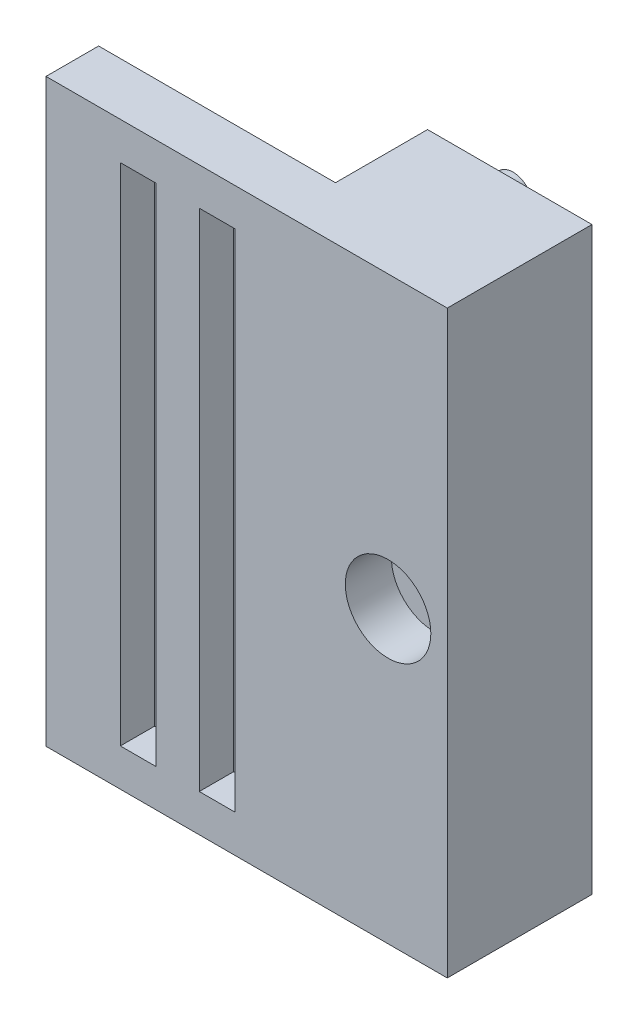
ISO-10303-21;
HEADER;
FILE_DESCRIPTION(('STEP AP214'),'2;1');
FILE_NAME('part.step','',(''),(''),'','','');
FILE_SCHEMA(('AUTOMOTIVE_DESIGN { 1 0 10303 214 1 1 1 1 }'));
ENDSEC;
DATA;
#1=APPLICATION_CONTEXT('core data for automotive mechanical design processes');
#2=APPLICATION_PROTOCOL_DEFINITION('international standard','automotive_design',2000,#1);
#3=PRODUCT_CONTEXT('',#1,'mechanical');
#4=PRODUCT('Part','Part','',(#3));
#5=PRODUCT_RELATED_PRODUCT_CATEGORY('part','',(#4));
#6=PRODUCT_DEFINITION_FORMATION('','',#4);
#7=PRODUCT_DEFINITION_CONTEXT('part definition',#1,'design');
#8=PRODUCT_DEFINITION('design','',#6,#7);
#9=PRODUCT_DEFINITION_SHAPE('','',#8);
#10=(LENGTH_UNIT() NAMED_UNIT(*) SI_UNIT(.MILLI.,.METRE.));
#11=(NAMED_UNIT(*) PLANE_ANGLE_UNIT() SI_UNIT($,.RADIAN.));
#12=(NAMED_UNIT(*) SI_UNIT($,.STERADIAN.) SOLID_ANGLE_UNIT());
#13=UNCERTAINTY_MEASURE_WITH_UNIT(LENGTH_MEASURE(1.E-05),#10,'distance_accuracy_value','');
#14=(GEOMETRIC_REPRESENTATION_CONTEXT(3) GLOBAL_UNCERTAINTY_ASSIGNED_CONTEXT((#13)) GLOBAL_UNIT_ASSIGNED_CONTEXT((#10,
#11,#12)) REPRESENTATION_CONTEXT('',''));
#15=CARTESIAN_POINT('',(0.,0.,0.));
#16=DIRECTION('',(0.,0.,1.));
#17=DIRECTION('',(1.,0.,0.));
#18=AXIS2_PLACEMENT_3D('',#15,#16,#17);
#19=CARTESIAN_POINT('',(-72.,0.,72.5));
#20=DIRECTION('',(0.,0.,1.));
#21=DIRECTION('',(1.,0.,0.));
#22=AXIS2_PLACEMENT_3D('',#19,#20,#21);
#23=PLANE('',#22);
#24=CARTESIAN_POINT('',(-72.,0.,72.5));
#25=DIRECTION('',(0.,0.,1.));
#26=DIRECTION('',(1.,0.,0.));
#27=AXIS2_PLACEMENT_3D('',#24,#25,#26);
#28=CIRCLE('',#27,1.7);
#29=CARTESIAN_POINT('',(-70.3,0.,72.5));
#30=VERTEX_POINT('',#29);
#31=EDGE_CURVE('E268',#30,#30,#28,.T.);
#32=ORIENTED_EDGE('',*,*,#31,.F.);
#33=EDGE_LOOP('',(#32));
#34=FACE_BOUND('',#33,.T.);
#35=CARTESIAN_POINT('',(-72.,0.,72.5));
#36=DIRECTION('',(0.,0.,1.));
#37=DIRECTION('',(1.,0.,0.));
#38=AXIS2_PLACEMENT_3D('',#35,#36,#37);
#39=CIRCLE('',#38,3.25);
#40=CARTESIAN_POINT('',(-68.75,0.,72.5));
#41=VERTEX_POINT('',#40);
#42=EDGE_CURVE('E11',#41,#41,#39,.T.);
#43=ORIENTED_EDGE('',*,*,#42,.T.);
#44=EDGE_LOOP('',(#43));
#45=FACE_BOUND('',#44,.T.);
#46=ADVANCED_FACE('F17',(#34,#45),#23,.T.);
#47=CARTESIAN_POINT('',(-76.5,18.,62.));
#48=DIRECTION('',(0.,0.,1.));
#49=DIRECTION('',(1.,0.,0.));
#50=AXIS2_PLACEMENT_3D('',#47,#48,#49);
#51=PLANE('',#50);
#52=CARTESIAN_POINT('',(-76.5,18.,62.));
#53=DIRECTION('',(0.,0.,1.));
#54=DIRECTION('',(1.,0.,0.));
#55=AXIS2_PLACEMENT_3D('',#52,#53,#54);
#56=CIRCLE('',#55,1.5);
#57=CARTESIAN_POINT('',(-75.,18.,62.));
#58=VERTEX_POINT('',#57);
#59=EDGE_CURVE('E264',#58,#58,#56,.T.);
#60=ORIENTED_EDGE('',*,*,#59,.F.);
#61=EDGE_LOOP('',(#60));
#62=FACE_BOUND('',#61,.T.);
#63=ADVANCED_FACE('F518',(#62),#51,.F.);
#64=CARTESIAN_POINT('',(-76.5,-18.,62.));
#65=DIRECTION('',(0.,0.,1.));
#66=DIRECTION('',(1.,0.,0.));
#67=AXIS2_PLACEMENT_3D('',#64,#65,#66);
#68=PLANE('',#67);
#69=CARTESIAN_POINT('',(-76.5,-18.,62.));
#70=DIRECTION('',(0.,0.,1.));
#71=DIRECTION('',(1.,0.,0.));
#72=AXIS2_PLACEMENT_3D('',#69,#70,#71);
#73=CIRCLE('',#72,1.5);
#74=CARTESIAN_POINT('',(-75.,-18.,62.));
#75=VERTEX_POINT('',#74);
#76=EDGE_CURVE('E260',#75,#75,#73,.T.);
#77=ORIENTED_EDGE('',*,*,#76,.F.);
#78=EDGE_LOOP('',(#77));
#79=FACE_BOUND('',#78,.T.);
#80=ADVANCED_FACE('F19',(#79),#68,.F.);
#81=CARTESIAN_POINT('',(-86.35,-19.2,73.4));
#82=DIRECTION('',(0.,0.,1.));
#83=DIRECTION('',(1.,0.,0.));
#84=AXIS2_PLACEMENT_3D('',#81,#82,#83);
#85=PLANE('',#84);
#86=DIRECTION('',(-1.,0.,0.));
#87=VECTOR('',#86,1.);
#88=CARTESIAN_POINT('',(-86.075,-18.75,73.4));
#89=LINE('',#88,#87);
#90=CARTESIAN_POINT('',(-84.2,-18.75,73.4));
#91=VERTEX_POINT('',#90);
#92=CARTESIAN_POINT('',(-85.8,-18.75,73.4));
#93=VERTEX_POINT('',#92);
#94=EDGE_CURVE('E235',#91,#93,#89,.T.);
#95=ORIENTED_EDGE('',*,*,#94,.T.);
#96=DIRECTION('',(0.,1.,0.));
#97=VECTOR('',#96,1.);
#98=CARTESIAN_POINT('',(-85.8,-18.975,73.4));
#99=LINE('',#98,#97);
#100=CARTESIAN_POINT('',(-85.8,18.75,73.4));
#101=VERTEX_POINT('',#100);
#102=EDGE_CURVE('E259',#93,#101,#99,.T.);
#103=ORIENTED_EDGE('',*,*,#102,.T.);
#104=DIRECTION('',(-1.,0.,0.));
#105=VECTOR('',#104,1.);
#106=CARTESIAN_POINT('',(-86.075,18.75,73.4));
#107=LINE('',#106,#105);
#108=CARTESIAN_POINT('',(-84.2,18.75,73.4));
#109=VERTEX_POINT('',#108);
#110=EDGE_CURVE('E151',#109,#101,#107,.T.);
#111=ORIENTED_EDGE('',*,*,#110,.F.);
#112=DIRECTION('',(0.,1.,0.));
#113=VECTOR('',#112,1.);
#114=CARTESIAN_POINT('',(-84.2,-18.975,73.4));
#115=LINE('',#114,#113);
#116=EDGE_CURVE('E249',#91,#109,#115,.T.);
#117=ORIENTED_EDGE('',*,*,#116,.F.);
#118=EDGE_LOOP('',(#95,#103,#111,#117));
#119=FACE_BOUND('',#118,.T.);
#120=DIRECTION('',(0.,1.,0.));
#121=VECTOR('',#120,1.);
#122=CARTESIAN_POINT('',(-86.35,-19.2,73.4));
#123=LINE('',#122,#121);
#124=CARTESIAN_POINT('',(-86.35,-19.2,73.4));
#125=VERTEX_POINT('',#124);
#126=CARTESIAN_POINT('',(-86.35,19.2,73.4));
#127=VERTEX_POINT('',#126);
#128=EDGE_CURVE('E27',#125,#127,#123,.T.);
#129=ORIENTED_EDGE('',*,*,#128,.F.);
#130=DIRECTION('',(1.,0.,0.));
#131=VECTOR('',#130,1.);
#132=CARTESIAN_POINT('',(-86.35,-19.2,73.4));
#133=LINE('',#132,#131);
#134=CARTESIAN_POINT('',(-83.65,-19.2,73.4));
#135=VERTEX_POINT('',#134);
#136=EDGE_CURVE('E118',#125,#135,#133,.T.);
#137=ORIENTED_EDGE('',*,*,#136,.T.);
#138=DIRECTION('',(0.,1.,0.));
#139=VECTOR('',#138,1.);
#140=CARTESIAN_POINT('',(-83.65,-19.2,73.4));
#141=LINE('',#140,#139);
#142=CARTESIAN_POINT('',(-83.65,19.2,73.4));
#143=VERTEX_POINT('',#142);
#144=EDGE_CURVE('E104',#135,#143,#141,.T.);
#145=ORIENTED_EDGE('',*,*,#144,.T.);
#146=DIRECTION('',(1.,0.,0.));
#147=VECTOR('',#146,1.);
#148=CARTESIAN_POINT('',(-86.35,19.2,73.4));
#149=LINE('',#148,#147);
#150=EDGE_CURVE('E21',#127,#143,#149,.T.);
#151=ORIENTED_EDGE('',*,*,#150,.F.);
#152=EDGE_LOOP('',(#129,#137,#145,#151));
#153=FACE_BOUND('',#152,.T.);
#154=ADVANCED_FACE('F119',(#119,#153),#85,.T.);
#155=CARTESIAN_POINT('',(-92.35,-19.2,73.4));
#156=DIRECTION('',(0.,0.,1.));
#157=DIRECTION('',(1.,0.,0.));
#158=AXIS2_PLACEMENT_3D('',#155,#156,#157);
#159=PLANE('',#158);
#160=DIRECTION('',(-1.,0.,0.));
#161=VECTOR('',#160,1.);
#162=CARTESIAN_POINT('',(-92.075,-18.75,73.4));
#163=LINE('',#162,#161);
#164=CARTESIAN_POINT('',(-90.2,-18.75,73.4));
#165=VERTEX_POINT('',#164);
#166=CARTESIAN_POINT('',(-91.8,-18.75,73.4));
#167=VERTEX_POINT('',#166);
#168=EDGE_CURVE('E161',#165,#167,#163,.T.);
#169=ORIENTED_EDGE('',*,*,#168,.T.);
#170=DIRECTION('',(0.,1.,0.));
#171=VECTOR('',#170,1.);
#172=CARTESIAN_POINT('',(-91.8,-18.975,73.4));
#173=LINE('',#172,#171);
#174=CARTESIAN_POINT('',(-91.8,18.75,73.4));
#175=VERTEX_POINT('',#174);
#176=EDGE_CURVE('E240',#167,#175,#173,.T.);
#177=ORIENTED_EDGE('',*,*,#176,.T.);
#178=DIRECTION('',(-1.,0.,0.));
#179=VECTOR('',#178,1.);
#180=CARTESIAN_POINT('',(-92.075,18.75,73.4));
#181=LINE('',#180,#179);
#182=CARTESIAN_POINT('',(-90.2,18.75,73.4));
#183=VERTEX_POINT('',#182);
#184=EDGE_CURVE('E226',#183,#175,#181,.T.);
#185=ORIENTED_EDGE('',*,*,#184,.F.);
#186=DIRECTION('',(0.,1.,0.));
#187=VECTOR('',#186,1.);
#188=CARTESIAN_POINT('',(-90.2,-18.975,73.4));
#189=LINE('',#188,#187);
#190=EDGE_CURVE('E218',#165,#183,#189,.T.);
#191=ORIENTED_EDGE('',*,*,#190,.F.);
#192=EDGE_LOOP('',(#169,#177,#185,#191));
#193=FACE_BOUND('',#192,.T.);
#194=DIRECTION('',(0.,1.,0.));
#195=VECTOR('',#194,1.);
#196=CARTESIAN_POINT('',(-92.35,-19.2,73.4));
#197=LINE('',#196,#195);
#198=CARTESIAN_POINT('',(-92.35,-19.2,73.4));
#199=VERTEX_POINT('',#198);
#200=CARTESIAN_POINT('',(-92.35,19.2,73.4));
#201=VERTEX_POINT('',#200);
#202=EDGE_CURVE('E130',#199,#201,#197,.T.);
#203=ORIENTED_EDGE('',*,*,#202,.F.);
#204=DIRECTION('',(1.,0.,0.));
#205=VECTOR('',#204,1.);
#206=CARTESIAN_POINT('',(-92.35,-19.2,73.4));
#207=LINE('',#206,#205);
#208=CARTESIAN_POINT('',(-89.65,-19.2,73.4));
#209=VERTEX_POINT('',#208);
#210=EDGE_CURVE('E273',#199,#209,#207,.T.);
#211=ORIENTED_EDGE('',*,*,#210,.T.);
#212=DIRECTION('',(0.,1.,0.));
#213=VECTOR('',#212,1.);
#214=CARTESIAN_POINT('',(-89.65,-19.2,73.4));
#215=LINE('',#214,#213);
#216=CARTESIAN_POINT('',(-89.65,19.2,73.4));
#217=VERTEX_POINT('',#216);
#218=EDGE_CURVE('E150',#209,#217,#215,.T.);
#219=ORIENTED_EDGE('',*,*,#218,.T.);
#220=DIRECTION('',(1.,0.,0.));
#221=VECTOR('',#220,1.);
#222=CARTESIAN_POINT('',(-92.35,19.2,73.4));
#223=LINE('',#222,#221);
#224=EDGE_CURVE('E136',#201,#217,#223,.T.);
#225=ORIENTED_EDGE('',*,*,#224,.F.);
#226=EDGE_LOOP('',(#203,#211,#219,#225));
#227=FACE_BOUND('',#226,.T.);
#228=ADVANCED_FACE('F513',(#193,#227),#159,.T.);
#229=CARTESIAN_POINT('',(-72.,0.,72.5));
#230=DIRECTION('',(0.,0.,1.));
#231=DIRECTION('',(1.,0.,0.));
#232=AXIS2_PLACEMENT_3D('',#229,#230,#231);
#233=CYLINDRICAL_SURFACE('',#232,3.25);
#234=CARTESIAN_POINT('',(-72.,0.,76.));
#235=DIRECTION('',(0.,0.,1.));
#236=DIRECTION('',(1.,0.,0.));
#237=AXIS2_PLACEMENT_3D('',#234,#235,#236);
#238=CIRCLE('',#237,3.25);
#239=CARTESIAN_POINT('',(-68.75,0.,76.));
#240=VERTEX_POINT('',#239);
#241=EDGE_CURVE('E194',#240,#240,#238,.T.);
#242=ORIENTED_EDGE('',*,*,#241,.T.);
#243=EDGE_LOOP('',(#242));
#244=FACE_BOUND('',#243,.T.);
#245=ORIENTED_EDGE('',*,*,#42,.F.);
#246=EDGE_LOOP('',(#245));
#247=FACE_BOUND('',#246,.T.);
#248=ADVANCED_FACE('F505',(#244,#247),#233,.F.);
#249=CARTESIAN_POINT('',(-86.35,-19.2,73.4));
#250=DIRECTION('',(1.,0.,0.));
#251=DIRECTION('',(0.,1.,0.));
#252=AXIS2_PLACEMENT_3D('',#249,#250,#251);
#253=PLANE('',#252);
#254=DIRECTION('',(0.,0.,1.));
#255=VECTOR('',#254,1.);
#256=CARTESIAN_POINT('',(-86.35,-19.2,73.4));
#257=LINE('',#256,#255);
#258=CARTESIAN_POINT('',(-86.35,-19.2,76.));
#259=VERTEX_POINT('',#258);
#260=EDGE_CURVE('E123',#125,#259,#257,.T.);
#261=ORIENTED_EDGE('',*,*,#260,.F.);
#262=ORIENTED_EDGE('',*,*,#128,.T.);
#263=DIRECTION('',(0.,0.,1.));
#264=VECTOR('',#263,1.);
#265=CARTESIAN_POINT('',(-86.35,19.2,73.4));
#266=LINE('',#265,#264);
#267=CARTESIAN_POINT('',(-86.35,19.2,76.));
#268=VERTEX_POINT('',#267);
#269=EDGE_CURVE('E115',#127,#268,#266,.T.);
#270=ORIENTED_EDGE('',*,*,#269,.T.);
#271=DIRECTION('',(0.,1.,0.));
#272=VECTOR('',#271,1.);
#273=CARTESIAN_POINT('',(-86.35,-20.625,76.));
#274=LINE('',#273,#272);
#275=EDGE_CURVE('E201',#259,#268,#274,.T.);
#276=ORIENTED_EDGE('',*,*,#275,.F.);
#277=EDGE_LOOP('',(#261,#262,#270,#276));
#278=FACE_BOUND('',#277,.T.);
#279=ADVANCED_FACE('F503',(#278),#253,.T.);
#280=CARTESIAN_POINT('',(-86.35,19.2,73.4));
#281=DIRECTION('',(0.,1.,0.));
#282=DIRECTION('',(1.,0.,0.));
#283=AXIS2_PLACEMENT_3D('',#280,#281,#282);
#284=PLANE('',#283);
#285=DIRECTION('',(-1.,0.,0.));
#286=VECTOR('',#285,1.);
#287=CARTESIAN_POINT('',(-83.175,19.2,76.));
#288=LINE('',#287,#286);
#289=CARTESIAN_POINT('',(-83.65,19.2,76.));
#290=VERTEX_POINT('',#289);
#291=EDGE_CURVE('E205',#290,#268,#288,.T.);
#292=ORIENTED_EDGE('',*,*,#291,.T.);
#293=ORIENTED_EDGE('',*,*,#269,.F.);
#294=ORIENTED_EDGE('',*,*,#150,.T.);
#295=DIRECTION('',(0.,0.,1.));
#296=VECTOR('',#295,1.);
#297=CARTESIAN_POINT('',(-83.65,19.2,73.4));
#298=LINE('',#297,#296);
#299=EDGE_CURVE('E112',#143,#290,#298,.T.);
#300=ORIENTED_EDGE('',*,*,#299,.T.);
#301=EDGE_LOOP('',(#292,#293,#294,#300));
#302=FACE_BOUND('',#301,.T.);
#303=ADVANCED_FACE('F498',(#302),#284,.F.);
#304=CARTESIAN_POINT('',(-83.65,-19.2,73.4));
#305=DIRECTION('',(1.,0.,0.));
#306=DIRECTION('',(0.,1.,0.));
#307=AXIS2_PLACEMENT_3D('',#304,#305,#306);
#308=PLANE('',#307);
#309=DIRECTION('',(0.,1.,0.));
#310=VECTOR('',#309,1.);
#311=CARTESIAN_POINT('',(-83.65,-20.625,76.));
#312=LINE('',#311,#310);
#313=CARTESIAN_POINT('',(-83.65,-19.2,76.));
#314=VERTEX_POINT('',#313);
#315=EDGE_CURVE('E209',#314,#290,#312,.T.);
#316=ORIENTED_EDGE('',*,*,#315,.T.);
#317=ORIENTED_EDGE('',*,*,#299,.F.);
#318=ORIENTED_EDGE('',*,*,#144,.F.);
#319=DIRECTION('',(0.,0.,1.));
#320=VECTOR('',#319,1.);
#321=CARTESIAN_POINT('',(-83.65,-19.2,73.4));
#322=LINE('',#321,#320);
#323=EDGE_CURVE('E110',#135,#314,#322,.T.);
#324=ORIENTED_EDGE('',*,*,#323,.T.);
#325=EDGE_LOOP('',(#316,#317,#318,#324));
#326=FACE_BOUND('',#325,.T.);
#327=ADVANCED_FACE('F107',(#326),#308,.F.);
#328=CARTESIAN_POINT('',(-86.35,-19.2,73.4));
#329=DIRECTION('',(0.,1.,0.));
#330=DIRECTION('',(1.,0.,0.));
#331=AXIS2_PLACEMENT_3D('',#328,#329,#330);
#332=PLANE('',#331);
#333=ORIENTED_EDGE('',*,*,#323,.F.);
#334=ORIENTED_EDGE('',*,*,#136,.F.);
#335=ORIENTED_EDGE('',*,*,#260,.T.);
#336=DIRECTION('',(-1.,0.,0.));
#337=VECTOR('',#336,1.);
#338=CARTESIAN_POINT('',(-83.175,-19.2,76.));
#339=LINE('',#338,#337);
#340=EDGE_CURVE('E128',#314,#259,#339,.T.);
#341=ORIENTED_EDGE('',*,*,#340,.F.);
#342=EDGE_LOOP('',(#333,#334,#335,#341));
#343=FACE_BOUND('',#342,.T.);
#344=ADVANCED_FACE('F126',(#343),#332,.T.);
#345=CARTESIAN_POINT('',(-92.35,-19.2,73.4));
#346=DIRECTION('',(1.,0.,0.));
#347=DIRECTION('',(0.,1.,0.));
#348=AXIS2_PLACEMENT_3D('',#345,#346,#347);
#349=PLANE('',#348);
#350=DIRECTION('',(0.,0.,1.));
#351=VECTOR('',#350,1.);
#352=CARTESIAN_POINT('',(-92.35,-19.2,73.4));
#353=LINE('',#352,#351);
#354=CARTESIAN_POINT('',(-92.35,-19.2,76.));
#355=VERTEX_POINT('',#354);
#356=EDGE_CURVE('E276',#199,#355,#353,.T.);
#357=ORIENTED_EDGE('',*,*,#356,.F.);
#358=ORIENTED_EDGE('',*,*,#202,.T.);
#359=DIRECTION('',(0.,0.,1.));
#360=VECTOR('',#359,1.);
#361=CARTESIAN_POINT('',(-92.35,19.2,73.4));
#362=LINE('',#361,#360);
#363=CARTESIAN_POINT('',(-92.35,19.2,76.));
#364=VERTEX_POINT('',#363);
#365=EDGE_CURVE('E146',#201,#364,#362,.T.);
#366=ORIENTED_EDGE('',*,*,#365,.T.);
#367=DIRECTION('',(0.,1.,0.));
#368=VECTOR('',#367,1.);
#369=CARTESIAN_POINT('',(-92.35,-20.625,76.));
#370=LINE('',#369,#368);
#371=EDGE_CURVE('E186',#355,#364,#370,.T.);
#372=ORIENTED_EDGE('',*,*,#371,.F.);
#373=EDGE_LOOP('',(#357,#358,#366,#372));
#374=FACE_BOUND('',#373,.T.);
#375=ADVANCED_FACE('F577',(#374),#349,.T.);
#376=CARTESIAN_POINT('',(-92.35,19.2,73.4));
#377=DIRECTION('',(0.,1.,0.));
#378=DIRECTION('',(1.,0.,0.));
#379=AXIS2_PLACEMENT_3D('',#376,#377,#378);
#380=PLANE('',#379);
#381=DIRECTION('',(-1.,0.,0.));
#382=VECTOR('',#381,1.);
#383=CARTESIAN_POINT('',(-86.175,19.2,76.));
#384=LINE('',#383,#382);
#385=CARTESIAN_POINT('',(-89.65,19.2,76.));
#386=VERTEX_POINT('',#385);
#387=EDGE_CURVE('E190',#386,#364,#384,.T.);
#388=ORIENTED_EDGE('',*,*,#387,.T.);
#389=ORIENTED_EDGE('',*,*,#365,.F.);
#390=ORIENTED_EDGE('',*,*,#224,.T.);
#391=DIRECTION('',(0.,0.,1.));
#392=VECTOR('',#391,1.);
#393=CARTESIAN_POINT('',(-89.65,19.2,73.4));
#394=LINE('',#393,#392);
#395=EDGE_CURVE('E281',#217,#386,#394,.T.);
#396=ORIENTED_EDGE('',*,*,#395,.T.);
#397=EDGE_LOOP('',(#388,#389,#390,#396));
#398=FACE_BOUND('',#397,.T.);
#399=ADVANCED_FACE('F540',(#398),#380,.F.);
#400=CARTESIAN_POINT('',(-89.65,-19.2,73.4));
#401=DIRECTION('',(1.,0.,0.));
#402=DIRECTION('',(0.,1.,0.));
#403=AXIS2_PLACEMENT_3D('',#400,#401,#402);
#404=PLANE('',#403);
#405=DIRECTION('',(0.,1.,0.));
#406=VECTOR('',#405,1.);
#407=CARTESIAN_POINT('',(-89.65,-20.625,76.));
#408=LINE('',#407,#406);
#409=CARTESIAN_POINT('',(-89.65,-19.2,76.));
#410=VERTEX_POINT('',#409);
#411=EDGE_CURVE('E195',#410,#386,#408,.T.);
#412=ORIENTED_EDGE('',*,*,#411,.T.);
#413=ORIENTED_EDGE('',*,*,#395,.F.);
#414=ORIENTED_EDGE('',*,*,#218,.F.);
#415=DIRECTION('',(0.,0.,1.));
#416=VECTOR('',#415,1.);
#417=CARTESIAN_POINT('',(-89.65,-19.2,73.4));
#418=LINE('',#417,#416);
#419=EDGE_CURVE('E272',#209,#410,#418,.T.);
#420=ORIENTED_EDGE('',*,*,#419,.T.);
#421=EDGE_LOOP('',(#412,#413,#414,#420));
#422=FACE_BOUND('',#421,.T.);
#423=ADVANCED_FACE('F536',(#422),#404,.F.);
#424=CARTESIAN_POINT('',(-92.35,-19.2,73.4));
#425=DIRECTION('',(0.,1.,0.));
#426=DIRECTION('',(1.,0.,0.));
#427=AXIS2_PLACEMENT_3D('',#424,#425,#426);
#428=PLANE('',#427);
#429=ORIENTED_EDGE('',*,*,#419,.F.);
#430=ORIENTED_EDGE('',*,*,#210,.F.);
#431=ORIENTED_EDGE('',*,*,#356,.T.);
#432=DIRECTION('',(-1.,0.,0.));
#433=VECTOR('',#432,1.);
#434=CARTESIAN_POINT('',(-86.175,-19.2,76.));
#435=LINE('',#434,#433);
#436=EDGE_CURVE('E184',#410,#355,#435,.T.);
#437=ORIENTED_EDGE('',*,*,#436,.F.);
#438=EDGE_LOOP('',(#429,#430,#431,#437));
#439=FACE_BOUND('',#438,.T.);
#440=ADVANCED_FACE('F539',(#439),#428,.T.);
#441=CARTESIAN_POINT('',(-72.,0.,48.5));
#442=DIRECTION('',(0.,0.,1.));
#443=DIRECTION('',(1.,0.,0.));
#444=AXIS2_PLACEMENT_3D('',#441,#442,#443);
#445=CYLINDRICAL_SURFACE('',#444,1.7);
#446=ORIENTED_EDGE('',*,*,#31,.T.);
#447=EDGE_LOOP('',(#446));
#448=FACE_BOUND('',#447,.T.);
#449=CARTESIAN_POINT('',(-72.,0.,65.));
#450=DIRECTION('',(0.,0.,1.));
#451=DIRECTION('',(1.,0.,0.));
#452=AXIS2_PLACEMENT_3D('',#449,#450,#451);
#453=CIRCLE('',#452,1.7);
#454=CARTESIAN_POINT('',(-70.3,0.,65.));
#455=VERTEX_POINT('',#454);
#456=EDGE_CURVE('E170',#455,#455,#453,.T.);
#457=ORIENTED_EDGE('',*,*,#456,.F.);
#458=EDGE_LOOP('',(#457));
#459=FACE_BOUND('',#458,.T.);
#460=ADVANCED_FACE('F567',(#448,#459),#445,.F.);
#461=CARTESIAN_POINT('',(-76.5,18.,62.));
#462=DIRECTION('',(0.,0.,1.));
#463=DIRECTION('',(1.,0.,0.));
#464=AXIS2_PLACEMENT_3D('',#461,#462,#463);
#465=CYLINDRICAL_SURFACE('',#464,1.5);
#466=CARTESIAN_POINT('',(-76.5,18.,65.));
#467=DIRECTION('',(0.,0.,1.));
#468=DIRECTION('',(1.,0.,0.));
#469=AXIS2_PLACEMENT_3D('',#466,#467,#468);
#470=CIRCLE('',#469,1.5);
#471=CARTESIAN_POINT('',(-75.,18.,65.));
#472=VERTEX_POINT('',#471);
#473=EDGE_CURVE('E166',#472,#472,#470,.T.);
#474=ORIENTED_EDGE('',*,*,#473,.F.);
#475=EDGE_LOOP('',(#474));
#476=FACE_BOUND('',#475,.T.);
#477=ORIENTED_EDGE('',*,*,#59,.T.);
#478=EDGE_LOOP('',(#477));
#479=FACE_BOUND('',#478,.T.);
#480=ADVANCED_FACE('F563',(#476,#479),#465,.T.);
#481=CARTESIAN_POINT('',(-76.5,-18.,62.));
#482=DIRECTION('',(0.,0.,1.));
#483=DIRECTION('',(1.,0.,0.));
#484=AXIS2_PLACEMENT_3D('',#481,#482,#483);
#485=CYLINDRICAL_SURFACE('',#484,1.5);
#486=CARTESIAN_POINT('',(-76.5,-18.,65.));
#487=DIRECTION('',(0.,0.,1.));
#488=DIRECTION('',(1.,0.,0.));
#489=AXIS2_PLACEMENT_3D('',#486,#487,#488);
#490=CIRCLE('',#489,1.5);
#491=CARTESIAN_POINT('',(-75.,-18.,65.));
#492=VERTEX_POINT('',#491);
#493=EDGE_CURVE('E145',#492,#492,#490,.T.);
#494=ORIENTED_EDGE('',*,*,#493,.F.);
#495=EDGE_LOOP('',(#494));
#496=FACE_BOUND('',#495,.T.);
#497=ORIENTED_EDGE('',*,*,#76,.T.);
#498=EDGE_LOOP('',(#497));
#499=FACE_BOUND('',#498,.T.);
#500=ADVANCED_FACE('F560',(#496,#499),#485,.T.);
#501=CARTESIAN_POINT('',(-85.8,-18.75,59.5));
#502=DIRECTION('',(1.,0.,0.));
#503=DIRECTION('',(0.,1.,0.));
#504=AXIS2_PLACEMENT_3D('',#501,#502,#503);
#505=PLANE('',#504);
#506=DIRECTION('',(0.,0.,1.));
#507=VECTOR('',#506,1.);
#508=CARTESIAN_POINT('',(-85.8,-18.75,59.5));
#509=LINE('',#508,#507);
#510=CARTESIAN_POINT('',(-85.8,-18.75,72.));
#511=VERTEX_POINT('',#510);
#512=EDGE_CURVE('E231',#511,#93,#509,.T.);
#513=ORIENTED_EDGE('',*,*,#512,.F.);
#514=DIRECTION('',(0.,1.,0.));
#515=VECTOR('',#514,1.);
#516=CARTESIAN_POINT('',(-85.8,-20.4,72.));
#517=LINE('',#516,#515);
#518=CARTESIAN_POINT('',(-85.8,18.75,72.));
#519=VERTEX_POINT('',#518);
#520=EDGE_CURVE('E316',#511,#519,#517,.T.);
#521=ORIENTED_EDGE('',*,*,#520,.T.);
#522=DIRECTION('',(0.,0.,1.));
#523=VECTOR('',#522,1.);
#524=CARTESIAN_POINT('',(-85.8,18.75,59.5));
#525=LINE('',#524,#523);
#526=EDGE_CURVE('E155',#519,#101,#525,.T.);
#527=ORIENTED_EDGE('',*,*,#526,.T.);
#528=ORIENTED_EDGE('',*,*,#102,.F.);
#529=EDGE_LOOP('',(#513,#521,#527,#528));
#530=FACE_BOUND('',#529,.T.);
#531=ADVANCED_FACE('F558',(#530),#505,.T.);
#532=CARTESIAN_POINT('',(-85.8,18.75,59.5));
#533=DIRECTION('',(0.,1.,0.));
#534=DIRECTION('',(1.,0.,0.));
#535=AXIS2_PLACEMENT_3D('',#532,#533,#534);
#536=PLANE('',#535);
#537=ORIENTED_EDGE('',*,*,#110,.T.);
#538=ORIENTED_EDGE('',*,*,#526,.F.);
#539=DIRECTION('',(-1.,0.,0.));
#540=VECTOR('',#539,1.);
#541=CARTESIAN_POINT('',(-91.9,18.75,72.));
#542=LINE('',#541,#540);
#543=CARTESIAN_POINT('',(-84.2,18.75,72.));
#544=VERTEX_POINT('',#543);
#545=EDGE_CURVE('E321',#544,#519,#542,.T.);
#546=ORIENTED_EDGE('',*,*,#545,.F.);
#547=DIRECTION('',(0.,0.,1.));
#548=VECTOR('',#547,1.);
#549=CARTESIAN_POINT('',(-84.2,18.75,59.5));
#550=LINE('',#549,#548);
#551=EDGE_CURVE('E156',#544,#109,#550,.T.);
#552=ORIENTED_EDGE('',*,*,#551,.T.);
#553=EDGE_LOOP('',(#537,#538,#546,#552));
#554=FACE_BOUND('',#553,.T.);
#555=ADVANCED_FACE('F554',(#554),#536,.F.);
#556=CARTESIAN_POINT('',(-84.2,-18.75,59.5));
#557=DIRECTION('',(1.,0.,0.));
#558=DIRECTION('',(0.,1.,0.));
#559=AXIS2_PLACEMENT_3D('',#556,#557,#558);
#560=PLANE('',#559);
#561=ORIENTED_EDGE('',*,*,#116,.T.);
#562=ORIENTED_EDGE('',*,*,#551,.F.);
#563=DIRECTION('',(0.,1.,0.));
#564=VECTOR('',#563,1.);
#565=CARTESIAN_POINT('',(-84.2,-20.4,72.));
#566=LINE('',#565,#564);
#567=CARTESIAN_POINT('',(-84.2,-18.75,72.));
#568=VERTEX_POINT('',#567);
#569=EDGE_CURVE('E336',#568,#544,#566,.T.);
#570=ORIENTED_EDGE('',*,*,#569,.F.);
#571=DIRECTION('',(0.,0.,1.));
#572=VECTOR('',#571,1.);
#573=CARTESIAN_POINT('',(-84.2,-18.75,59.5));
#574=LINE('',#573,#572);
#575=EDGE_CURVE('E236',#568,#91,#574,.T.);
#576=ORIENTED_EDGE('',*,*,#575,.T.);
#577=EDGE_LOOP('',(#561,#562,#570,#576));
#578=FACE_BOUND('',#577,.T.);
#579=ADVANCED_FACE('F551',(#578),#560,.F.);
#580=CARTESIAN_POINT('',(-85.8,-18.75,59.5));
#581=DIRECTION('',(0.,1.,0.));
#582=DIRECTION('',(1.,0.,0.));
#583=AXIS2_PLACEMENT_3D('',#580,#581,#582);
#584=PLANE('',#583);
#585=ORIENTED_EDGE('',*,*,#575,.F.);
#586=DIRECTION('',(-1.,0.,0.));
#587=VECTOR('',#586,1.);
#588=CARTESIAN_POINT('',(-91.9,-18.75,72.));
#589=LINE('',#588,#587);
#590=EDGE_CURVE('E320',#568,#511,#589,.T.);
#591=ORIENTED_EDGE('',*,*,#590,.T.);
#592=ORIENTED_EDGE('',*,*,#512,.T.);
#593=ORIENTED_EDGE('',*,*,#94,.F.);
#594=EDGE_LOOP('',(#585,#591,#592,#593));
#595=FACE_BOUND('',#594,.T.);
#596=ADVANCED_FACE('F535',(#595),#584,.T.);
#597=CARTESIAN_POINT('',(-91.8,-18.75,59.5));
#598=DIRECTION('',(1.,0.,0.));
#599=DIRECTION('',(0.,1.,0.));
#600=AXIS2_PLACEMENT_3D('',#597,#598,#599);
#601=PLANE('',#600);
#602=DIRECTION('',(0.,0.,1.));
#603=VECTOR('',#602,1.);
#604=CARTESIAN_POINT('',(-91.8,-18.75,59.5));
#605=LINE('',#604,#603);
#606=CARTESIAN_POINT('',(-91.8,-18.75,72.));
#607=VERTEX_POINT('',#606);
#608=EDGE_CURVE('E157',#607,#167,#605,.T.);
#609=ORIENTED_EDGE('',*,*,#608,.F.);
#610=DIRECTION('',(0.,1.,0.));
#611=VECTOR('',#610,1.);
#612=CARTESIAN_POINT('',(-91.8,-20.4,72.));
#613=LINE('',#612,#611);
#614=CARTESIAN_POINT('',(-91.8,18.75,72.));
#615=VERTEX_POINT('',#614);
#616=EDGE_CURVE('E332',#607,#615,#613,.T.);
#617=ORIENTED_EDGE('',*,*,#616,.T.);
#618=DIRECTION('',(0.,0.,1.));
#619=VECTOR('',#618,1.);
#620=CARTESIAN_POINT('',(-91.8,18.75,59.5));
#621=LINE('',#620,#619);
#622=EDGE_CURVE('E230',#615,#175,#621,.T.);
#623=ORIENTED_EDGE('',*,*,#622,.T.);
#624=ORIENTED_EDGE('',*,*,#176,.F.);
#625=EDGE_LOOP('',(#609,#617,#623,#624));
#626=FACE_BOUND('',#625,.T.);
#627=ADVANCED_FACE('F437',(#626),#601,.T.);
#628=CARTESIAN_POINT('',(-91.8,18.75,59.5));
#629=DIRECTION('',(0.,1.,0.));
#630=DIRECTION('',(1.,0.,0.));
#631=AXIS2_PLACEMENT_3D('',#628,#629,#630);
#632=PLANE('',#631);
#633=ORIENTED_EDGE('',*,*,#184,.T.);
#634=ORIENTED_EDGE('',*,*,#622,.F.);
#635=DIRECTION('',(-1.,0.,0.));
#636=VECTOR('',#635,1.);
#637=CARTESIAN_POINT('',(-94.9,18.75,72.));
#638=LINE('',#637,#636);
#639=CARTESIAN_POINT('',(-90.2,18.75,72.));
#640=VERTEX_POINT('',#639);
#641=EDGE_CURVE('E326',#640,#615,#638,.T.);
#642=ORIENTED_EDGE('',*,*,#641,.F.);
#643=DIRECTION('',(0.,0.,1.));
#644=VECTOR('',#643,1.);
#645=CARTESIAN_POINT('',(-90.2,18.75,59.5));
#646=LINE('',#645,#644);
#647=EDGE_CURVE('E222',#640,#183,#646,.T.);
#648=ORIENTED_EDGE('',*,*,#647,.T.);
#649=EDGE_LOOP('',(#633,#634,#642,#648));
#650=FACE_BOUND('',#649,.T.);
#651=ADVANCED_FACE('F450',(#650),#632,.F.);
#652=CARTESIAN_POINT('',(-90.2,-18.75,59.5));
#653=DIRECTION('',(1.,0.,0.));
#654=DIRECTION('',(0.,1.,0.));
#655=AXIS2_PLACEMENT_3D('',#652,#653,#654);
#656=PLANE('',#655);
#657=ORIENTED_EDGE('',*,*,#190,.T.);
#658=ORIENTED_EDGE('',*,*,#647,.F.);
#659=DIRECTION('',(0.,1.,0.));
#660=VECTOR('',#659,1.);
#661=CARTESIAN_POINT('',(-90.2,-20.4,72.));
#662=LINE('',#661,#660);
#663=CARTESIAN_POINT('',(-90.2,-18.75,72.));
#664=VERTEX_POINT('',#663);
#665=EDGE_CURVE('E322',#664,#640,#662,.T.);
#666=ORIENTED_EDGE('',*,*,#665,.F.);
#667=DIRECTION('',(0.,0.,1.));
#668=VECTOR('',#667,1.);
#669=CARTESIAN_POINT('',(-90.2,-18.75,59.5));
#670=LINE('',#669,#668);
#671=EDGE_CURVE('E162',#664,#165,#670,.T.);
#672=ORIENTED_EDGE('',*,*,#671,.T.);
#673=EDGE_LOOP('',(#657,#658,#666,#672));
#674=FACE_BOUND('',#673,.T.);
#675=ADVANCED_FACE('F545',(#674),#656,.F.);
#676=CARTESIAN_POINT('',(-91.8,-18.75,59.5));
#677=DIRECTION('',(0.,1.,0.));
#678=DIRECTION('',(1.,0.,0.));
#679=AXIS2_PLACEMENT_3D('',#676,#677,#678);
#680=PLANE('',#679);
#681=ORIENTED_EDGE('',*,*,#671,.F.);
#682=DIRECTION('',(-1.,0.,0.));
#683=VECTOR('',#682,1.);
#684=CARTESIAN_POINT('',(-94.9,-18.75,72.));
#685=LINE('',#684,#683);
#686=EDGE_CURVE('E424',#664,#607,#685,.T.);
#687=ORIENTED_EDGE('',*,*,#686,.T.);
#688=ORIENTED_EDGE('',*,*,#608,.T.);
#689=ORIENTED_EDGE('',*,*,#168,.F.);
#690=EDGE_LOOP('',(#681,#687,#688,#689));
#691=FACE_BOUND('',#690,.T.);
#692=ADVANCED_FACE('F542',(#691),#680,.T.);
#693=CARTESIAN_POINT('',(-67.5,-22.05,65.));
#694=DIRECTION('',(1.,0.,0.));
#695=DIRECTION('',(0.,1.,0.));
#696=AXIS2_PLACEMENT_3D('',#693,#694,#695);
#697=PLANE('',#696);
#698=DIRECTION('',(0.,0.,1.));
#699=VECTOR('',#698,1.);
#700=CARTESIAN_POINT('',(-67.5,-22.05,65.));
#701=LINE('',#700,#699);
#702=CARTESIAN_POINT('',(-67.5,-22.05,65.));
#703=VERTEX_POINT('',#702);
#704=CARTESIAN_POINT('',(-67.5,-22.05,76.));
#705=VERTEX_POINT('',#704);
#706=EDGE_CURVE('E419',#703,#705,#701,.T.);
#707=ORIENTED_EDGE('',*,*,#706,.F.);
#708=DIRECTION('',(0.,1.,0.));
#709=VECTOR('',#708,1.);
#710=CARTESIAN_POINT('',(-67.5,-22.05,65.));
#711=LINE('',#710,#709);
#712=CARTESIAN_POINT('',(-67.5,22.05,65.));
#713=VERTEX_POINT('',#712);
#714=EDGE_CURVE('E142',#703,#713,#711,.T.);
#715=ORIENTED_EDGE('',*,*,#714,.T.);
#716=DIRECTION('',(0.,0.,1.));
#717=VECTOR('',#716,1.);
#718=CARTESIAN_POINT('',(-67.5,22.05,65.));
#719=LINE('',#718,#717);
#720=CARTESIAN_POINT('',(-67.5,22.05,76.));
#721=VERTEX_POINT('',#720);
#722=EDGE_CURVE('E140',#713,#721,#719,.T.);
#723=ORIENTED_EDGE('',*,*,#722,.T.);
#724=DIRECTION('',(0.,1.,0.));
#725=VECTOR('',#724,1.);
#726=CARTESIAN_POINT('',(-67.5,-22.05,76.));
#727=LINE('',#726,#725);
#728=EDGE_CURVE('E181',#705,#721,#727,.T.);
#729=ORIENTED_EDGE('',*,*,#728,.F.);
#730=EDGE_LOOP('',(#707,#715,#723,#729));
#731=FACE_BOUND('',#730,.T.);
#732=ADVANCED_FACE('F363',(#731),#697,.T.);
#733=CARTESIAN_POINT('',(-80.,-22.05,76.));
#734=DIRECTION('',(0.,0.,1.));
#735=DIRECTION('',(1.,0.,0.));
#736=AXIS2_PLACEMENT_3D('',#733,#734,#735);
#737=PLANE('',#736);
#738=ORIENTED_EDGE('',*,*,#241,.F.);
#739=EDGE_LOOP('',(#738));
#740=FACE_BOUND('',#739,.T.);
#741=ORIENTED_EDGE('',*,*,#340,.T.);
#742=ORIENTED_EDGE('',*,*,#275,.T.);
#743=ORIENTED_EDGE('',*,*,#291,.F.);
#744=ORIENTED_EDGE('',*,*,#315,.F.);
#745=EDGE_LOOP('',(#741,#742,#743,#744));
#746=FACE_BOUND('',#745,.T.);
#747=ORIENTED_EDGE('',*,*,#436,.T.);
#748=ORIENTED_EDGE('',*,*,#371,.T.);
#749=ORIENTED_EDGE('',*,*,#387,.F.);
#750=ORIENTED_EDGE('',*,*,#411,.F.);
#751=EDGE_LOOP('',(#747,#748,#749,#750));
#752=FACE_BOUND('',#751,.T.);
#753=DIRECTION('',(1.,0.,0.));
#754=VECTOR('',#753,1.);
#755=CARTESIAN_POINT('',(-98.,22.05,76.));
#756=LINE('',#755,#754);
#757=CARTESIAN_POINT('',(-98.,22.05,76.));
#758=VERTEX_POINT('',#757);
#759=EDGE_CURVE('E348',#758,#721,#756,.T.);
#760=ORIENTED_EDGE('',*,*,#759,.F.);
#761=DIRECTION('',(0.,1.,0.));
#762=VECTOR('',#761,1.);
#763=CARTESIAN_POINT('',(-98.,-22.05,76.));
#764=LINE('',#763,#762);
#765=CARTESIAN_POINT('',(-98.,-22.05,76.));
#766=VERTEX_POINT('',#765);
#767=EDGE_CURVE('E174',#766,#758,#764,.T.);
#768=ORIENTED_EDGE('',*,*,#767,.F.);
#769=DIRECTION('',(-1.,0.,0.));
#770=VECTOR('',#769,1.);
#771=CARTESIAN_POINT('',(-67.5,-22.05,76.));
#772=LINE('',#771,#770);
#773=EDGE_CURVE('E420',#705,#766,#772,.T.);
#774=ORIENTED_EDGE('',*,*,#773,.F.);
#775=ORIENTED_EDGE('',*,*,#728,.T.);
#776=EDGE_LOOP('',(#760,#768,#774,#775));
#777=FACE_BOUND('',#776,.T.);
#778=ADVANCED_FACE('F501',(#740,#746,#752,#777),#737,.T.);
#779=CARTESIAN_POINT('',(-98.,-22.05,72.));
#780=DIRECTION('',(1.,0.,0.));
#781=DIRECTION('',(0.,1.,0.));
#782=AXIS2_PLACEMENT_3D('',#779,#780,#781);
#783=PLANE('',#782);
#784=ORIENTED_EDGE('',*,*,#767,.T.);
#785=DIRECTION('',(0.,0.,1.));
#786=VECTOR('',#785,1.);
#787=CARTESIAN_POINT('',(-98.,22.05,72.));
#788=LINE('',#787,#786);
#789=CARTESIAN_POINT('',(-98.,22.05,72.));
#790=VERTEX_POINT('',#789);
#791=EDGE_CURVE('E344',#790,#758,#788,.T.);
#792=ORIENTED_EDGE('',*,*,#791,.F.);
#793=DIRECTION('',(0.,1.,0.));
#794=VECTOR('',#793,1.);
#795=CARTESIAN_POINT('',(-98.,-22.05,72.));
#796=LINE('',#795,#794);
#797=CARTESIAN_POINT('',(-98.,-22.05,72.));
#798=VERTEX_POINT('',#797);
#799=EDGE_CURVE('E315',#798,#790,#796,.T.);
#800=ORIENTED_EDGE('',*,*,#799,.F.);
#801=DIRECTION('',(0.,0.,1.));
#802=VECTOR('',#801,1.);
#803=CARTESIAN_POINT('',(-98.,-22.05,72.));
#804=LINE('',#803,#802);
#805=EDGE_CURVE('E305',#798,#766,#804,.T.);
#806=ORIENTED_EDGE('',*,*,#805,.T.);
#807=EDGE_LOOP('',(#784,#792,#800,#806));
#808=FACE_BOUND('',#807,.T.);
#809=ADVANCED_FACE('F691',(#808),#783,.F.);
#810=CARTESIAN_POINT('',(-80.,-22.05,65.));
#811=DIRECTION('',(0.,0.,1.));
#812=DIRECTION('',(1.,0.,0.));
#813=AXIS2_PLACEMENT_3D('',#810,#811,#812);
#814=PLANE('',#813);
#815=ORIENTED_EDGE('',*,*,#456,.T.);
#816=EDGE_LOOP('',(#815));
#817=FACE_BOUND('',#816,.T.);
#818=ORIENTED_EDGE('',*,*,#473,.T.);
#819=EDGE_LOOP('',(#818));
#820=FACE_BOUND('',#819,.T.);
#821=ORIENTED_EDGE('',*,*,#493,.T.);
#822=EDGE_LOOP('',(#821));
#823=FACE_BOUND('',#822,.T.);
#824=DIRECTION('',(1.,0.,0.));
#825=VECTOR('',#824,1.);
#826=CARTESIAN_POINT('',(-80.,22.05,65.));
#827=LINE('',#826,#825);
#828=CARTESIAN_POINT('',(-80.,22.05,65.));
#829=VERTEX_POINT('',#828);
#830=EDGE_CURVE('E340',#829,#713,#827,.T.);
#831=ORIENTED_EDGE('',*,*,#830,.T.);
#832=ORIENTED_EDGE('',*,*,#714,.F.);
#833=DIRECTION('',(1.,0.,0.));
#834=VECTOR('',#833,1.);
#835=CARTESIAN_POINT('',(-80.,-22.05,65.));
#836=LINE('',#835,#834);
#837=CARTESIAN_POINT('',(-80.,-22.05,65.));
#838=VERTEX_POINT('',#837);
#839=EDGE_CURVE('E310',#838,#703,#836,.T.);
#840=ORIENTED_EDGE('',*,*,#839,.F.);
#841=DIRECTION('',(0.,1.,0.));
#842=VECTOR('',#841,1.);
#843=CARTESIAN_POINT('',(-80.,-22.05,65.));
#844=LINE('',#843,#842);
#845=EDGE_CURVE('E386',#838,#829,#844,.T.);
#846=ORIENTED_EDGE('',*,*,#845,.T.);
#847=EDGE_LOOP('',(#831,#832,#840,#846));
#848=FACE_BOUND('',#847,.T.);
#849=ADVANCED_FACE('F381',(#817,#820,#823,#848),#814,.F.);
#850=CARTESIAN_POINT('',(-80.,22.05,65.));
#851=DIRECTION('',(0.,1.,0.));
#852=DIRECTION('',(1.,0.,0.));
#853=AXIS2_PLACEMENT_3D('',#850,#851,#852);
#854=PLANE('',#853);
#855=ORIENTED_EDGE('',*,*,#830,.F.);
#856=DIRECTION('',(0.,0.,1.));
#857=VECTOR('',#856,1.);
#858=CARTESIAN_POINT('',(-80.,22.05,65.));
#859=LINE('',#858,#857);
#860=CARTESIAN_POINT('',(-80.,22.05,72.));
#861=VERTEX_POINT('',#860);
#862=EDGE_CURVE('E397',#829,#861,#859,.T.);
#863=ORIENTED_EDGE('',*,*,#862,.T.);
#864=DIRECTION('',(1.,0.,0.));
#865=VECTOR('',#864,1.);
#866=CARTESIAN_POINT('',(-98.,22.05,72.));
#867=LINE('',#866,#865);
#868=EDGE_CURVE('E311',#790,#861,#867,.T.);
#869=ORIENTED_EDGE('',*,*,#868,.F.);
#870=ORIENTED_EDGE('',*,*,#791,.T.);
#871=ORIENTED_EDGE('',*,*,#759,.T.);
#872=ORIENTED_EDGE('',*,*,#722,.F.);
#873=EDGE_LOOP('',(#855,#863,#869,#870,#871,#872));
#874=FACE_BOUND('',#873,.T.);
#875=ADVANCED_FACE('F373',(#874),#854,.T.);
#876=CARTESIAN_POINT('',(-98.,-22.05,72.));
#877=DIRECTION('',(0.,0.,1.));
#878=DIRECTION('',(1.,0.,0.));
#879=AXIS2_PLACEMENT_3D('',#876,#877,#878);
#880=PLANE('',#879);
#881=ORIENTED_EDGE('',*,*,#569,.T.);
#882=ORIENTED_EDGE('',*,*,#545,.T.);
#883=ORIENTED_EDGE('',*,*,#520,.F.);
#884=ORIENTED_EDGE('',*,*,#590,.F.);
#885=EDGE_LOOP('',(#881,#882,#883,#884));
#886=FACE_BOUND('',#885,.T.);
#887=ORIENTED_EDGE('',*,*,#665,.T.);
#888=ORIENTED_EDGE('',*,*,#641,.T.);
#889=ORIENTED_EDGE('',*,*,#616,.F.);
#890=ORIENTED_EDGE('',*,*,#686,.F.);
#891=EDGE_LOOP('',(#887,#888,#889,#890));
#892=FACE_BOUND('',#891,.T.);
#893=ORIENTED_EDGE('',*,*,#868,.T.);
#894=DIRECTION('',(0.,1.,0.));
#895=VECTOR('',#894,1.);
#896=CARTESIAN_POINT('',(-80.,-22.05,72.));
#897=LINE('',#896,#895);
#898=CARTESIAN_POINT('',(-80.,-22.05,72.));
#899=VERTEX_POINT('',#898);
#900=EDGE_CURVE('E402',#899,#861,#897,.T.);
#901=ORIENTED_EDGE('',*,*,#900,.F.);
#902=DIRECTION('',(1.,0.,0.));
#903=VECTOR('',#902,1.);
#904=CARTESIAN_POINT('',(-98.,-22.05,72.));
#905=LINE('',#904,#903);
#906=EDGE_CURVE('E307',#798,#899,#905,.T.);
#907=ORIENTED_EDGE('',*,*,#906,.F.);
#908=ORIENTED_EDGE('',*,*,#799,.T.);
#909=EDGE_LOOP('',(#893,#901,#907,#908));
#910=FACE_BOUND('',#909,.T.);
#911=ADVANCED_FACE('F446',(#886,#892,#910),#880,.F.);
#912=CARTESIAN_POINT('',(-80.,-22.05,65.));
#913=DIRECTION('',(0.,1.,0.));
#914=DIRECTION('',(1.,0.,0.));
#915=AXIS2_PLACEMENT_3D('',#912,#913,#914);
#916=PLANE('',#915);
#917=ORIENTED_EDGE('',*,*,#706,.T.);
#918=ORIENTED_EDGE('',*,*,#773,.T.);
#919=ORIENTED_EDGE('',*,*,#805,.F.);
#920=ORIENTED_EDGE('',*,*,#906,.T.);
#921=DIRECTION('',(0.,0.,1.));
#922=VECTOR('',#921,1.);
#923=CARTESIAN_POINT('',(-80.,-22.05,65.));
#924=LINE('',#923,#922);
#925=EDGE_CURVE('E396',#838,#899,#924,.T.);
#926=ORIENTED_EDGE('',*,*,#925,.F.);
#927=ORIENTED_EDGE('',*,*,#839,.T.);
#928=EDGE_LOOP('',(#917,#918,#919,#920,#926,#927));
#929=FACE_BOUND('',#928,.T.);
#930=ADVANCED_FACE('F721',(#929),#916,.F.);
#931=CARTESIAN_POINT('',(-80.,-22.05,65.));
#932=DIRECTION('',(1.,0.,0.));
#933=DIRECTION('',(0.,1.,0.));
#934=AXIS2_PLACEMENT_3D('',#931,#932,#933);
#935=PLANE('',#934);
#936=ORIENTED_EDGE('',*,*,#900,.T.);
#937=ORIENTED_EDGE('',*,*,#862,.F.);
#938=ORIENTED_EDGE('',*,*,#845,.F.);
#939=ORIENTED_EDGE('',*,*,#925,.T.);
#940=EDGE_LOOP('',(#936,#937,#938,#939));
#941=FACE_BOUND('',#940,.T.);
#942=ADVANCED_FACE('F400',(#941),#935,.F.);
#943=CLOSED_SHELL('',(#46,#63,#80,#154,#228,#248,#279,#303,#327,#344,#375,#399,#423,#440,#460,
#480,#500,#531,#555,#579,#596,#627,#651,#675,#692,#732,#778,#809,#849,#875,#911,#930,#942));
#944=MANIFOLD_SOLID_BREP('B1',#943);
#945=ADVANCED_BREP_SHAPE_REPRESENTATION('',(#18,#944),#14);
#946=SHAPE_DEFINITION_REPRESENTATION(#9,#945);
ENDSEC;
END-ISO-10303-21;
